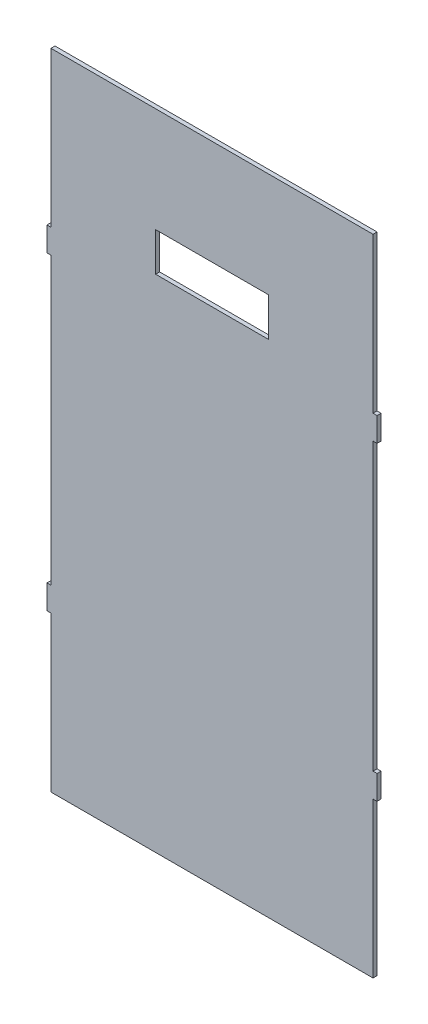
ISO-10303-21;
HEADER;
FILE_DESCRIPTION(('STEP AP214'),'2;1');
FILE_NAME('part.step','',(''),(''),'','','');
FILE_SCHEMA(('AUTOMOTIVE_DESIGN { 1 0 10303 214 1 1 1 1 }'));
ENDSEC;
DATA;
#1=APPLICATION_CONTEXT('core data for automotive mechanical design processes');
#2=APPLICATION_PROTOCOL_DEFINITION('international standard','automotive_design',2000,#1);
#3=PRODUCT_CONTEXT('',#1,'mechanical');
#4=PRODUCT('Part','Part','',(#3));
#5=PRODUCT_RELATED_PRODUCT_CATEGORY('part','',(#4));
#6=PRODUCT_DEFINITION_FORMATION('','',#4);
#7=PRODUCT_DEFINITION_CONTEXT('part definition',#1,'design');
#8=PRODUCT_DEFINITION('design','',#6,#7);
#9=PRODUCT_DEFINITION_SHAPE('','',#8);
#10=(LENGTH_UNIT() NAMED_UNIT(*) SI_UNIT(.MILLI.,.METRE.));
#11=(NAMED_UNIT(*) PLANE_ANGLE_UNIT() SI_UNIT($,.RADIAN.));
#12=(NAMED_UNIT(*) SI_UNIT($,.STERADIAN.) SOLID_ANGLE_UNIT());
#13=UNCERTAINTY_MEASURE_WITH_UNIT(LENGTH_MEASURE(1.E-05),#10,'distance_accuracy_value','');
#14=(GEOMETRIC_REPRESENTATION_CONTEXT(3) GLOBAL_UNCERTAINTY_ASSIGNED_CONTEXT((#13)) GLOBAL_UNIT_ASSIGNED_CONTEXT((#10,
#11,#12)) REPRESENTATION_CONTEXT('',''));
#15=CARTESIAN_POINT('',(0.,0.,0.));
#16=DIRECTION('',(0.,0.,1.));
#17=DIRECTION('',(1.,0.,0.));
#18=AXIS2_PLACEMENT_3D('',#15,#16,#17);
#19=CARTESIAN_POINT('',(200.,-207.5,5.));
#20=DIRECTION('',(-1.,0.,0.));
#21=DIRECTION('',(0.,-1.,0.));
#22=AXIS2_PLACEMENT_3D('',#19,#20,#21);
#23=PLANE('',#22);
#24=DIRECTION('',(0.,1.,0.));
#25=VECTOR('',#24,1.);
#26=CARTESIAN_POINT('',(200.,-207.5,0.));
#27=LINE('',#26,#25);
#28=CARTESIAN_POINT('',(200.,-400.,0.));
#29=VERTEX_POINT('',#28);
#30=CARTESIAN_POINT('',(200.,-207.5,0.));
#31=VERTEX_POINT('',#30);
#32=EDGE_CURVE('E226',#29,#31,#27,.T.);
#33=ORIENTED_EDGE('',*,*,#32,.T.);
#34=DIRECTION('',(0.,0.,-1.));
#35=VECTOR('',#34,1.);
#36=CARTESIAN_POINT('',(200.,-207.5,5.));
#37=LINE('',#36,#35);
#38=CARTESIAN_POINT('',(200.,-207.5,5.));
#39=VERTEX_POINT('',#38);
#40=EDGE_CURVE('E11',#39,#31,#37,.T.);
#41=ORIENTED_EDGE('',*,*,#40,.F.);
#42=DIRECTION('',(0.,1.,0.));
#43=VECTOR('',#42,1.);
#44=CARTESIAN_POINT('',(200.,-207.5,5.));
#45=LINE('',#44,#43);
#46=CARTESIAN_POINT('',(200.,-400.,5.));
#47=VERTEX_POINT('',#46);
#48=EDGE_CURVE('E230',#47,#39,#45,.T.);
#49=ORIENTED_EDGE('',*,*,#48,.F.);
#50=DIRECTION('',(0.,0.,-1.));
#51=VECTOR('',#50,1.);
#52=CARTESIAN_POINT('',(200.,-400.,5.));
#53=LINE('',#52,#51);
#54=EDGE_CURVE('E272',#47,#29,#53,.T.);
#55=ORIENTED_EDGE('',*,*,#54,.T.);
#56=EDGE_LOOP('',(#33,#41,#49,#55));
#57=FACE_BOUND('',#56,.T.);
#58=ADVANCED_FACE('F33',(#57),#23,.F.);
#59=CARTESIAN_POINT('',(205.,-207.5,5.));
#60=DIRECTION('',(0.,1.,0.));
#61=DIRECTION('',(0.,0.,1.));
#62=AXIS2_PLACEMENT_3D('',#59,#60,#61);
#63=PLANE('',#62);
#64=DIRECTION('',(1.,0.,0.));
#65=VECTOR('',#64,1.);
#66=CARTESIAN_POINT('',(205.,-207.5,0.));
#67=LINE('',#66,#65);
#68=CARTESIAN_POINT('',(205.,-207.5,0.));
#69=VERTEX_POINT('',#68);
#70=EDGE_CURVE('E275',#31,#69,#67,.T.);
#71=ORIENTED_EDGE('',*,*,#70,.T.);
#72=DIRECTION('',(0.,0.,-1.));
#73=VECTOR('',#72,1.);
#74=CARTESIAN_POINT('',(205.,-207.5,5.));
#75=LINE('',#74,#73);
#76=CARTESIAN_POINT('',(205.,-207.5,5.));
#77=VERTEX_POINT('',#76);
#78=EDGE_CURVE('E40',#77,#69,#75,.T.);
#79=ORIENTED_EDGE('',*,*,#78,.F.);
#80=DIRECTION('',(1.,0.,0.));
#81=VECTOR('',#80,1.);
#82=CARTESIAN_POINT('',(205.,-207.5,5.));
#83=LINE('',#82,#81);
#84=EDGE_CURVE('E233',#39,#77,#83,.T.);
#85=ORIENTED_EDGE('',*,*,#84,.F.);
#86=ORIENTED_EDGE('',*,*,#40,.T.);
#87=EDGE_LOOP('',(#71,#79,#85,#86));
#88=FACE_BOUND('',#87,.T.);
#89=ADVANCED_FACE('F390',(#88),#63,.F.);
#90=CARTESIAN_POINT('',(205.,-207.5,5.));
#91=DIRECTION('',(-1.,0.,0.));
#92=DIRECTION('',(0.,-1.,0.));
#93=AXIS2_PLACEMENT_3D('',#90,#91,#92);
#94=PLANE('',#93);
#95=DIRECTION('',(0.,1.,0.));
#96=VECTOR('',#95,1.);
#97=CARTESIAN_POINT('',(205.,-207.5,0.));
#98=LINE('',#97,#96);
#99=CARTESIAN_POINT('',(205.,-177.5,0.));
#100=VERTEX_POINT('',#99);
#101=EDGE_CURVE('E277',#69,#100,#98,.T.);
#102=ORIENTED_EDGE('',*,*,#101,.T.);
#103=DIRECTION('',(0.,0.,-1.));
#104=VECTOR('',#103,1.);
#105=CARTESIAN_POINT('',(205.,-177.5,5.));
#106=LINE('',#105,#104);
#107=CARTESIAN_POINT('',(205.,-177.5,5.));
#108=VERTEX_POINT('',#107);
#109=EDGE_CURVE('E362',#108,#100,#106,.T.);
#110=ORIENTED_EDGE('',*,*,#109,.F.);
#111=DIRECTION('',(0.,1.,0.));
#112=VECTOR('',#111,1.);
#113=CARTESIAN_POINT('',(205.,-207.5,5.));
#114=LINE('',#113,#112);
#115=EDGE_CURVE('E236',#77,#108,#114,.T.);
#116=ORIENTED_EDGE('',*,*,#115,.F.);
#117=ORIENTED_EDGE('',*,*,#78,.T.);
#118=EDGE_LOOP('',(#102,#110,#116,#117));
#119=FACE_BOUND('',#118,.T.);
#120=ADVANCED_FACE('F369',(#119),#94,.F.);
#121=CARTESIAN_POINT('',(205.,-177.5,5.));
#122=DIRECTION('',(0.,-1.,0.));
#123=DIRECTION('',(0.,0.,-1.));
#124=AXIS2_PLACEMENT_3D('',#121,#122,#123);
#125=PLANE('',#124);
#126=DIRECTION('',(-1.,0.,0.));
#127=VECTOR('',#126,1.);
#128=CARTESIAN_POINT('',(205.,-177.5,0.));
#129=LINE('',#128,#127);
#130=CARTESIAN_POINT('',(200.,-177.5,0.));
#131=VERTEX_POINT('',#130);
#132=EDGE_CURVE('E279',#100,#131,#129,.T.);
#133=ORIENTED_EDGE('',*,*,#132,.T.);
#134=DIRECTION('',(0.,0.,-1.));
#135=VECTOR('',#134,1.);
#136=CARTESIAN_POINT('',(200.,-177.5,5.));
#137=LINE('',#136,#135);
#138=CARTESIAN_POINT('',(200.,-177.5,5.));
#139=VERTEX_POINT('',#138);
#140=EDGE_CURVE('E359',#139,#131,#137,.T.);
#141=ORIENTED_EDGE('',*,*,#140,.F.);
#142=DIRECTION('',(-1.,0.,0.));
#143=VECTOR('',#142,1.);
#144=CARTESIAN_POINT('',(205.,-177.5,5.));
#145=LINE('',#144,#143);
#146=EDGE_CURVE('E238',#108,#139,#145,.T.);
#147=ORIENTED_EDGE('',*,*,#146,.F.);
#148=ORIENTED_EDGE('',*,*,#109,.T.);
#149=EDGE_LOOP('',(#133,#141,#147,#148));
#150=FACE_BOUND('',#149,.T.);
#151=ADVANCED_FACE('F378',(#150),#125,.F.);
#152=CARTESIAN_POINT('',(200.,177.5,5.));
#153=DIRECTION('',(-1.,0.,0.));
#154=DIRECTION('',(0.,-1.,0.));
#155=AXIS2_PLACEMENT_3D('',#152,#153,#154);
#156=PLANE('',#155);
#157=DIRECTION('',(0.,1.,0.));
#158=VECTOR('',#157,1.);
#159=CARTESIAN_POINT('',(200.,177.5,0.));
#160=LINE('',#159,#158);
#161=CARTESIAN_POINT('',(200.,177.5,0.));
#162=VERTEX_POINT('',#161);
#163=EDGE_CURVE('E281',#131,#162,#160,.T.);
#164=ORIENTED_EDGE('',*,*,#163,.T.);
#165=DIRECTION('',(0.,0.,-1.));
#166=VECTOR('',#165,1.);
#167=CARTESIAN_POINT('',(200.,177.5,5.));
#168=LINE('',#167,#166);
#169=CARTESIAN_POINT('',(200.,177.5,5.));
#170=VERTEX_POINT('',#169);
#171=EDGE_CURVE('E356',#170,#162,#168,.T.);
#172=ORIENTED_EDGE('',*,*,#171,.F.);
#173=DIRECTION('',(0.,1.,0.));
#174=VECTOR('',#173,1.);
#175=CARTESIAN_POINT('',(200.,177.5,5.));
#176=LINE('',#175,#174);
#177=EDGE_CURVE('E240',#139,#170,#176,.T.);
#178=ORIENTED_EDGE('',*,*,#177,.F.);
#179=ORIENTED_EDGE('',*,*,#140,.T.);
#180=EDGE_LOOP('',(#164,#172,#178,#179));
#181=FACE_BOUND('',#180,.T.);
#182=ADVANCED_FACE('F382',(#181),#156,.F.);
#183=CARTESIAN_POINT('',(205.,177.5,5.));
#184=DIRECTION('',(0.,1.,0.));
#185=DIRECTION('',(0.,0.,1.));
#186=AXIS2_PLACEMENT_3D('',#183,#184,#185);
#187=PLANE('',#186);
#188=DIRECTION('',(1.,0.,0.));
#189=VECTOR('',#188,1.);
#190=CARTESIAN_POINT('',(205.,177.5,0.));
#191=LINE('',#190,#189);
#192=CARTESIAN_POINT('',(205.,177.5,0.));
#193=VERTEX_POINT('',#192);
#194=EDGE_CURVE('E283',#162,#193,#191,.T.);
#195=ORIENTED_EDGE('',*,*,#194,.T.);
#196=DIRECTION('',(0.,0.,-1.));
#197=VECTOR('',#196,1.);
#198=CARTESIAN_POINT('',(205.,177.5,5.));
#199=LINE('',#198,#197);
#200=CARTESIAN_POINT('',(205.,177.5,5.));
#201=VERTEX_POINT('',#200);
#202=EDGE_CURVE('E353',#201,#193,#199,.T.);
#203=ORIENTED_EDGE('',*,*,#202,.F.);
#204=DIRECTION('',(1.,0.,0.));
#205=VECTOR('',#204,1.);
#206=CARTESIAN_POINT('',(205.,177.5,5.));
#207=LINE('',#206,#205);
#208=EDGE_CURVE('E242',#170,#201,#207,.T.);
#209=ORIENTED_EDGE('',*,*,#208,.F.);
#210=ORIENTED_EDGE('',*,*,#171,.T.);
#211=EDGE_LOOP('',(#195,#203,#209,#210));
#212=FACE_BOUND('',#211,.T.);
#213=ADVANCED_FACE('F463',(#212),#187,.F.);
#214=CARTESIAN_POINT('',(205.,207.5,5.));
#215=DIRECTION('',(-1.,0.,0.));
#216=DIRECTION('',(0.,-1.,0.));
#217=AXIS2_PLACEMENT_3D('',#214,#215,#216);
#218=PLANE('',#217);
#219=DIRECTION('',(0.,1.,0.));
#220=VECTOR('',#219,1.);
#221=CARTESIAN_POINT('',(205.,207.5,0.));
#222=LINE('',#221,#220);
#223=CARTESIAN_POINT('',(205.,207.5,0.));
#224=VERTEX_POINT('',#223);
#225=EDGE_CURVE('E285',#193,#224,#222,.T.);
#226=ORIENTED_EDGE('',*,*,#225,.T.);
#227=DIRECTION('',(0.,0.,-1.));
#228=VECTOR('',#227,1.);
#229=CARTESIAN_POINT('',(205.,207.5,5.));
#230=LINE('',#229,#228);
#231=CARTESIAN_POINT('',(205.,207.5,5.));
#232=VERTEX_POINT('',#231);
#233=EDGE_CURVE('E350',#232,#224,#230,.T.);
#234=ORIENTED_EDGE('',*,*,#233,.F.);
#235=DIRECTION('',(0.,1.,0.));
#236=VECTOR('',#235,1.);
#237=CARTESIAN_POINT('',(205.,207.5,5.));
#238=LINE('',#237,#236);
#239=EDGE_CURVE('E244',#201,#232,#238,.T.);
#240=ORIENTED_EDGE('',*,*,#239,.F.);
#241=ORIENTED_EDGE('',*,*,#202,.T.);
#242=EDGE_LOOP('',(#226,#234,#240,#241));
#243=FACE_BOUND('',#242,.T.);
#244=ADVANCED_FACE('F461',(#243),#218,.F.);
#245=CARTESIAN_POINT('',(205.,207.5,5.));
#246=DIRECTION('',(0.,-1.,0.));
#247=DIRECTION('',(0.,0.,-1.));
#248=AXIS2_PLACEMENT_3D('',#245,#246,#247);
#249=PLANE('',#248);
#250=DIRECTION('',(-1.,0.,0.));
#251=VECTOR('',#250,1.);
#252=CARTESIAN_POINT('',(205.,207.5,0.));
#253=LINE('',#252,#251);
#254=CARTESIAN_POINT('',(200.,207.5,0.));
#255=VERTEX_POINT('',#254);
#256=EDGE_CURVE('E287',#224,#255,#253,.T.);
#257=ORIENTED_EDGE('',*,*,#256,.T.);
#258=DIRECTION('',(0.,0.,-1.));
#259=VECTOR('',#258,1.);
#260=CARTESIAN_POINT('',(200.,207.5,5.));
#261=LINE('',#260,#259);
#262=CARTESIAN_POINT('',(200.,207.5,5.));
#263=VERTEX_POINT('',#262);
#264=EDGE_CURVE('E347',#263,#255,#261,.T.);
#265=ORIENTED_EDGE('',*,*,#264,.F.);
#266=DIRECTION('',(-1.,0.,0.));
#267=VECTOR('',#266,1.);
#268=CARTESIAN_POINT('',(205.,207.5,5.));
#269=LINE('',#268,#267);
#270=EDGE_CURVE('E246',#232,#263,#269,.T.);
#271=ORIENTED_EDGE('',*,*,#270,.F.);
#272=ORIENTED_EDGE('',*,*,#233,.T.);
#273=EDGE_LOOP('',(#257,#265,#271,#272));
#274=FACE_BOUND('',#273,.T.);
#275=ADVANCED_FACE('F456',(#274),#249,.F.);
#276=CARTESIAN_POINT('',(200.,400.,5.));
#277=DIRECTION('',(-1.,0.,0.));
#278=DIRECTION('',(0.,-1.,0.));
#279=AXIS2_PLACEMENT_3D('',#276,#277,#278);
#280=PLANE('',#279);
#281=DIRECTION('',(0.,1.,0.));
#282=VECTOR('',#281,1.);
#283=CARTESIAN_POINT('',(200.,400.,0.));
#284=LINE('',#283,#282);
#285=CARTESIAN_POINT('',(200.,400.,0.));
#286=VERTEX_POINT('',#285);
#287=EDGE_CURVE('E289',#255,#286,#284,.T.);
#288=ORIENTED_EDGE('',*,*,#287,.T.);
#289=DIRECTION('',(0.,0.,-1.));
#290=VECTOR('',#289,1.);
#291=CARTESIAN_POINT('',(200.,400.,5.));
#292=LINE('',#291,#290);
#293=CARTESIAN_POINT('',(200.,400.,5.));
#294=VERTEX_POINT('',#293);
#295=EDGE_CURVE('E344',#294,#286,#292,.T.);
#296=ORIENTED_EDGE('',*,*,#295,.F.);
#297=DIRECTION('',(0.,1.,0.));
#298=VECTOR('',#297,1.);
#299=CARTESIAN_POINT('',(200.,400.,5.));
#300=LINE('',#299,#298);
#301=EDGE_CURVE('E248',#263,#294,#300,.T.);
#302=ORIENTED_EDGE('',*,*,#301,.F.);
#303=ORIENTED_EDGE('',*,*,#264,.T.);
#304=EDGE_LOOP('',(#288,#296,#302,#303));
#305=FACE_BOUND('',#304,.T.);
#306=ADVANCED_FACE('F451',(#305),#280,.F.);
#307=CARTESIAN_POINT('',(-200.,400.,5.));
#308=DIRECTION('',(0.,-1.,0.));
#309=DIRECTION('',(0.,0.,-1.));
#310=AXIS2_PLACEMENT_3D('',#307,#308,#309);
#311=PLANE('',#310);
#312=DIRECTION('',(-1.,0.,0.));
#313=VECTOR('',#312,1.);
#314=CARTESIAN_POINT('',(-200.,400.,0.));
#315=LINE('',#314,#313);
#316=CARTESIAN_POINT('',(-200.,400.,0.));
#317=VERTEX_POINT('',#316);
#318=EDGE_CURVE('E291',#286,#317,#315,.T.);
#319=ORIENTED_EDGE('',*,*,#318,.T.);
#320=DIRECTION('',(0.,0.,-1.));
#321=VECTOR('',#320,1.);
#322=CARTESIAN_POINT('',(-200.,400.,5.));
#323=LINE('',#322,#321);
#324=CARTESIAN_POINT('',(-200.,400.,5.));
#325=VERTEX_POINT('',#324);
#326=EDGE_CURVE('E341',#325,#317,#323,.T.);
#327=ORIENTED_EDGE('',*,*,#326,.F.);
#328=DIRECTION('',(-1.,0.,0.));
#329=VECTOR('',#328,1.);
#330=CARTESIAN_POINT('',(-200.,400.,5.));
#331=LINE('',#330,#329);
#332=EDGE_CURVE('E250',#294,#325,#331,.T.);
#333=ORIENTED_EDGE('',*,*,#332,.F.);
#334=ORIENTED_EDGE('',*,*,#295,.T.);
#335=EDGE_LOOP('',(#319,#327,#333,#334));
#336=FACE_BOUND('',#335,.T.);
#337=ADVANCED_FACE('F447',(#336),#311,.F.);
#338=CARTESIAN_POINT('',(-200.,400.,5.));
#339=DIRECTION('',(1.,0.,0.));
#340=DIRECTION('',(0.,1.,0.));
#341=AXIS2_PLACEMENT_3D('',#338,#339,#340);
#342=PLANE('',#341);
#343=DIRECTION('',(0.,-1.,0.));
#344=VECTOR('',#343,1.);
#345=CARTESIAN_POINT('',(-200.,400.,0.));
#346=LINE('',#345,#344);
#347=CARTESIAN_POINT('',(-200.,207.5,0.));
#348=VERTEX_POINT('',#347);
#349=EDGE_CURVE('E293',#317,#348,#346,.T.);
#350=ORIENTED_EDGE('',*,*,#349,.T.);
#351=DIRECTION('',(0.,0.,-1.));
#352=VECTOR('',#351,1.);
#353=CARTESIAN_POINT('',(-200.,207.5,5.));
#354=LINE('',#353,#352);
#355=CARTESIAN_POINT('',(-200.,207.5,5.));
#356=VERTEX_POINT('',#355);
#357=EDGE_CURVE('E338',#356,#348,#354,.T.);
#358=ORIENTED_EDGE('',*,*,#357,.F.);
#359=DIRECTION('',(0.,-1.,0.));
#360=VECTOR('',#359,1.);
#361=CARTESIAN_POINT('',(-200.,400.,5.));
#362=LINE('',#361,#360);
#363=EDGE_CURVE('E252',#325,#356,#362,.T.);
#364=ORIENTED_EDGE('',*,*,#363,.F.);
#365=ORIENTED_EDGE('',*,*,#326,.T.);
#366=EDGE_LOOP('',(#350,#358,#364,#365));
#367=FACE_BOUND('',#366,.T.);
#368=ADVANCED_FACE('F442',(#367),#342,.F.);
#369=CARTESIAN_POINT('',(-205.,207.5,5.));
#370=DIRECTION('',(0.,-1.,0.));
#371=DIRECTION('',(0.,0.,-1.));
#372=AXIS2_PLACEMENT_3D('',#369,#370,#371);
#373=PLANE('',#372);
#374=DIRECTION('',(-1.,0.,0.));
#375=VECTOR('',#374,1.);
#376=CARTESIAN_POINT('',(-205.,207.5,0.));
#377=LINE('',#376,#375);
#378=CARTESIAN_POINT('',(-205.,207.5,0.));
#379=VERTEX_POINT('',#378);
#380=EDGE_CURVE('E295',#348,#379,#377,.T.);
#381=ORIENTED_EDGE('',*,*,#380,.T.);
#382=DIRECTION('',(0.,0.,-1.));
#383=VECTOR('',#382,1.);
#384=CARTESIAN_POINT('',(-205.,207.5,5.));
#385=LINE('',#384,#383);
#386=CARTESIAN_POINT('',(-205.,207.5,5.));
#387=VERTEX_POINT('',#386);
#388=EDGE_CURVE('E335',#387,#379,#385,.T.);
#389=ORIENTED_EDGE('',*,*,#388,.F.);
#390=DIRECTION('',(-1.,0.,0.));
#391=VECTOR('',#390,1.);
#392=CARTESIAN_POINT('',(-205.,207.5,5.));
#393=LINE('',#392,#391);
#394=EDGE_CURVE('E254',#356,#387,#393,.T.);
#395=ORIENTED_EDGE('',*,*,#394,.F.);
#396=ORIENTED_EDGE('',*,*,#357,.T.);
#397=EDGE_LOOP('',(#381,#389,#395,#396));
#398=FACE_BOUND('',#397,.T.);
#399=ADVANCED_FACE('F436',(#398),#373,.F.);
#400=CARTESIAN_POINT('',(-205.,207.5,5.));
#401=DIRECTION('',(1.,0.,0.));
#402=DIRECTION('',(0.,1.,0.));
#403=AXIS2_PLACEMENT_3D('',#400,#401,#402);
#404=PLANE('',#403);
#405=DIRECTION('',(0.,-1.,0.));
#406=VECTOR('',#405,1.);
#407=CARTESIAN_POINT('',(-205.,207.5,0.));
#408=LINE('',#407,#406);
#409=CARTESIAN_POINT('',(-205.,177.5,0.));
#410=VERTEX_POINT('',#409);
#411=EDGE_CURVE('E297',#379,#410,#408,.T.);
#412=ORIENTED_EDGE('',*,*,#411,.T.);
#413=DIRECTION('',(0.,0.,-1.));
#414=VECTOR('',#413,1.);
#415=CARTESIAN_POINT('',(-205.,177.5,5.));
#416=LINE('',#415,#414);
#417=CARTESIAN_POINT('',(-205.,177.5,5.));
#418=VERTEX_POINT('',#417);
#419=EDGE_CURVE('E332',#418,#410,#416,.T.);
#420=ORIENTED_EDGE('',*,*,#419,.F.);
#421=DIRECTION('',(0.,-1.,0.));
#422=VECTOR('',#421,1.);
#423=CARTESIAN_POINT('',(-205.,207.5,5.));
#424=LINE('',#423,#422);
#425=EDGE_CURVE('E256',#387,#418,#424,.T.);
#426=ORIENTED_EDGE('',*,*,#425,.F.);
#427=ORIENTED_EDGE('',*,*,#388,.T.);
#428=EDGE_LOOP('',(#412,#420,#426,#427));
#429=FACE_BOUND('',#428,.T.);
#430=ADVANCED_FACE('F432',(#429),#404,.F.);
#431=CARTESIAN_POINT('',(-205.,177.5,5.));
#432=DIRECTION('',(0.,1.,0.));
#433=DIRECTION('',(-1.,0.,0.));
#434=AXIS2_PLACEMENT_3D('',#431,#432,#433);
#435=PLANE('',#434);
#436=DIRECTION('',(1.,0.,0.));
#437=VECTOR('',#436,1.);
#438=CARTESIAN_POINT('',(-205.,177.5,0.));
#439=LINE('',#438,#437);
#440=CARTESIAN_POINT('',(-200.,177.5,0.));
#441=VERTEX_POINT('',#440);
#442=EDGE_CURVE('E299',#410,#441,#439,.T.);
#443=ORIENTED_EDGE('',*,*,#442,.T.);
#444=DIRECTION('',(0.,0.,-1.));
#445=VECTOR('',#444,1.);
#446=CARTESIAN_POINT('',(-200.,177.5,5.));
#447=LINE('',#446,#445);
#448=CARTESIAN_POINT('',(-200.,177.5,5.));
#449=VERTEX_POINT('',#448);
#450=EDGE_CURVE('E329',#449,#441,#447,.T.);
#451=ORIENTED_EDGE('',*,*,#450,.F.);
#452=DIRECTION('',(1.,0.,0.));
#453=VECTOR('',#452,1.);
#454=CARTESIAN_POINT('',(-205.,177.5,5.));
#455=LINE('',#454,#453);
#456=EDGE_CURVE('E258',#418,#449,#455,.T.);
#457=ORIENTED_EDGE('',*,*,#456,.F.);
#458=ORIENTED_EDGE('',*,*,#419,.T.);
#459=EDGE_LOOP('',(#443,#451,#457,#458));
#460=FACE_BOUND('',#459,.T.);
#461=ADVANCED_FACE('F427',(#460),#435,.F.);
#462=CARTESIAN_POINT('',(-200.,177.5,5.));
#463=DIRECTION('',(1.,0.,0.));
#464=DIRECTION('',(0.,0.,-1.));
#465=AXIS2_PLACEMENT_3D('',#462,#463,#464);
#466=PLANE('',#465);
#467=DIRECTION('',(0.,-1.,0.));
#468=VECTOR('',#467,1.);
#469=CARTESIAN_POINT('',(-200.,177.5,0.));
#470=LINE('',#469,#468);
#471=CARTESIAN_POINT('',(-200.,-177.5,0.));
#472=VERTEX_POINT('',#471);
#473=EDGE_CURVE('E301',#441,#472,#470,.T.);
#474=ORIENTED_EDGE('',*,*,#473,.T.);
#475=DIRECTION('',(0.,0.,-1.));
#476=VECTOR('',#475,1.);
#477=CARTESIAN_POINT('',(-200.,-177.5,5.));
#478=LINE('',#477,#476);
#479=CARTESIAN_POINT('',(-200.,-177.5,5.));
#480=VERTEX_POINT('',#479);
#481=EDGE_CURVE('E326',#480,#472,#478,.T.);
#482=ORIENTED_EDGE('',*,*,#481,.F.);
#483=DIRECTION('',(0.,-1.,0.));
#484=VECTOR('',#483,1.);
#485=CARTESIAN_POINT('',(-200.,177.5,5.));
#486=LINE('',#485,#484);
#487=EDGE_CURVE('E260',#449,#480,#486,.T.);
#488=ORIENTED_EDGE('',*,*,#487,.F.);
#489=ORIENTED_EDGE('',*,*,#450,.T.);
#490=EDGE_LOOP('',(#474,#482,#488,#489));
#491=FACE_BOUND('',#490,.T.);
#492=ADVANCED_FACE('F421',(#491),#466,.F.);
#493=CARTESIAN_POINT('',(-205.,-177.5,5.));
#494=DIRECTION('',(0.,-1.,0.));
#495=DIRECTION('',(1.,0.,0.));
#496=AXIS2_PLACEMENT_3D('',#493,#494,#495);
#497=PLANE('',#496);
#498=DIRECTION('',(-1.,0.,0.));
#499=VECTOR('',#498,1.);
#500=CARTESIAN_POINT('',(-205.,-177.5,0.));
#501=LINE('',#500,#499);
#502=CARTESIAN_POINT('',(-205.,-177.5,0.));
#503=VERTEX_POINT('',#502);
#504=EDGE_CURVE('E303',#472,#503,#501,.T.);
#505=ORIENTED_EDGE('',*,*,#504,.T.);
#506=DIRECTION('',(0.,0.,-1.));
#507=VECTOR('',#506,1.);
#508=CARTESIAN_POINT('',(-205.,-177.5,5.));
#509=LINE('',#508,#507);
#510=CARTESIAN_POINT('',(-205.,-177.5,5.));
#511=VERTEX_POINT('',#510);
#512=EDGE_CURVE('E323',#511,#503,#509,.T.);
#513=ORIENTED_EDGE('',*,*,#512,.F.);
#514=DIRECTION('',(-1.,0.,0.));
#515=VECTOR('',#514,1.);
#516=CARTESIAN_POINT('',(-205.,-177.5,5.));
#517=LINE('',#516,#515);
#518=EDGE_CURVE('E262',#480,#511,#517,.T.);
#519=ORIENTED_EDGE('',*,*,#518,.F.);
#520=ORIENTED_EDGE('',*,*,#481,.T.);
#521=EDGE_LOOP('',(#505,#513,#519,#520));
#522=FACE_BOUND('',#521,.T.);
#523=ADVANCED_FACE('F417',(#522),#497,.F.);
#524=CARTESIAN_POINT('',(-205.,-207.5,5.));
#525=DIRECTION('',(1.,0.,0.));
#526=DIRECTION('',(0.,1.,0.));
#527=AXIS2_PLACEMENT_3D('',#524,#525,#526);
#528=PLANE('',#527);
#529=DIRECTION('',(0.,-1.,0.));
#530=VECTOR('',#529,1.);
#531=CARTESIAN_POINT('',(-205.,-207.5,0.));
#532=LINE('',#531,#530);
#533=CARTESIAN_POINT('',(-205.,-207.5,0.));
#534=VERTEX_POINT('',#533);
#535=EDGE_CURVE('E305',#503,#534,#532,.T.);
#536=ORIENTED_EDGE('',*,*,#535,.T.);
#537=DIRECTION('',(0.,0.,-1.));
#538=VECTOR('',#537,1.);
#539=CARTESIAN_POINT('',(-205.,-207.5,5.));
#540=LINE('',#539,#538);
#541=CARTESIAN_POINT('',(-205.,-207.5,5.));
#542=VERTEX_POINT('',#541);
#543=EDGE_CURVE('E320',#542,#534,#540,.T.);
#544=ORIENTED_EDGE('',*,*,#543,.F.);
#545=DIRECTION('',(0.,-1.,0.));
#546=VECTOR('',#545,1.);
#547=CARTESIAN_POINT('',(-205.,-207.5,5.));
#548=LINE('',#547,#546);
#549=EDGE_CURVE('E264',#511,#542,#548,.T.);
#550=ORIENTED_EDGE('',*,*,#549,.F.);
#551=ORIENTED_EDGE('',*,*,#512,.T.);
#552=EDGE_LOOP('',(#536,#544,#550,#551));
#553=FACE_BOUND('',#552,.T.);
#554=ADVANCED_FACE('F412',(#553),#528,.F.);
#555=CARTESIAN_POINT('',(-205.,-207.5,5.));
#556=DIRECTION('',(0.,1.,0.));
#557=DIRECTION('',(0.,0.,1.));
#558=AXIS2_PLACEMENT_3D('',#555,#556,#557);
#559=PLANE('',#558);
#560=DIRECTION('',(1.,0.,0.));
#561=VECTOR('',#560,1.);
#562=CARTESIAN_POINT('',(-205.,-207.5,0.));
#563=LINE('',#562,#561);
#564=CARTESIAN_POINT('',(-200.,-207.5,0.));
#565=VERTEX_POINT('',#564);
#566=EDGE_CURVE('E307',#534,#565,#563,.T.);
#567=ORIENTED_EDGE('',*,*,#566,.T.);
#568=DIRECTION('',(0.,0.,-1.));
#569=VECTOR('',#568,1.);
#570=CARTESIAN_POINT('',(-200.,-207.5,5.));
#571=LINE('',#570,#569);
#572=CARTESIAN_POINT('',(-200.,-207.5,5.));
#573=VERTEX_POINT('',#572);
#574=EDGE_CURVE('E317',#573,#565,#571,.T.);
#575=ORIENTED_EDGE('',*,*,#574,.F.);
#576=DIRECTION('',(1.,0.,0.));
#577=VECTOR('',#576,1.);
#578=CARTESIAN_POINT('',(-205.,-207.5,5.));
#579=LINE('',#578,#577);
#580=EDGE_CURVE('E266',#542,#573,#579,.T.);
#581=ORIENTED_EDGE('',*,*,#580,.F.);
#582=ORIENTED_EDGE('',*,*,#543,.T.);
#583=EDGE_LOOP('',(#567,#575,#581,#582));
#584=FACE_BOUND('',#583,.T.);
#585=ADVANCED_FACE('F406',(#584),#559,.F.);
#586=CARTESIAN_POINT('',(-200.,-207.5,5.));
#587=DIRECTION('',(1.,0.,0.));
#588=DIRECTION('',(0.,1.,0.));
#589=AXIS2_PLACEMENT_3D('',#586,#587,#588);
#590=PLANE('',#589);
#591=DIRECTION('',(0.,-1.,0.));
#592=VECTOR('',#591,1.);
#593=CARTESIAN_POINT('',(-200.,-207.5,0.));
#594=LINE('',#593,#592);
#595=CARTESIAN_POINT('',(-200.,-400.,0.));
#596=VERTEX_POINT('',#595);
#597=EDGE_CURVE('E309',#565,#596,#594,.T.);
#598=ORIENTED_EDGE('',*,*,#597,.T.);
#599=DIRECTION('',(0.,0.,-1.));
#600=VECTOR('',#599,1.);
#601=CARTESIAN_POINT('',(-200.,-400.,5.));
#602=LINE('',#601,#600);
#603=CARTESIAN_POINT('',(-200.,-400.,5.));
#604=VERTEX_POINT('',#603);
#605=EDGE_CURVE('E314',#604,#596,#602,.T.);
#606=ORIENTED_EDGE('',*,*,#605,.F.);
#607=DIRECTION('',(0.,-1.,0.));
#608=VECTOR('',#607,1.);
#609=CARTESIAN_POINT('',(-200.,-207.5,5.));
#610=LINE('',#609,#608);
#611=EDGE_CURVE('E268',#573,#604,#610,.T.);
#612=ORIENTED_EDGE('',*,*,#611,.F.);
#613=ORIENTED_EDGE('',*,*,#574,.T.);
#614=EDGE_LOOP('',(#598,#606,#612,#613));
#615=FACE_BOUND('',#614,.T.);
#616=ADVANCED_FACE('F402',(#615),#590,.F.);
#617=CARTESIAN_POINT('',(-200.,-400.,5.));
#618=DIRECTION('',(0.,1.,0.));
#619=DIRECTION('',(-1.,0.,0.));
#620=AXIS2_PLACEMENT_3D('',#617,#618,#619);
#621=PLANE('',#620);
#622=DIRECTION('',(1.,0.,0.));
#623=VECTOR('',#622,1.);
#624=CARTESIAN_POINT('',(-200.,-400.,0.));
#625=LINE('',#624,#623);
#626=EDGE_CURVE('E234',#596,#29,#625,.T.);
#627=ORIENTED_EDGE('',*,*,#626,.T.);
#628=ORIENTED_EDGE('',*,*,#54,.F.);
#629=DIRECTION('',(1.,0.,0.));
#630=VECTOR('',#629,1.);
#631=CARTESIAN_POINT('',(-200.,-400.,5.));
#632=LINE('',#631,#630);
#633=EDGE_CURVE('E270',#604,#47,#632,.T.);
#634=ORIENTED_EDGE('',*,*,#633,.F.);
#635=ORIENTED_EDGE('',*,*,#605,.T.);
#636=EDGE_LOOP('',(#627,#628,#634,#635));
#637=FACE_BOUND('',#636,.T.);
#638=ADVANCED_FACE('F397',(#637),#621,.F.);
#639=CARTESIAN_POINT('',(0.,0.,5.));
#640=DIRECTION('',(0.,0.,1.));
#641=DIRECTION('',(1.,0.,0.));
#642=AXIS2_PLACEMENT_3D('',#639,#640,#641);
#643=PLANE('',#642);
#644=DIRECTION('',(0.,-1.,0.));
#645=VECTOR('',#644,1.);
#646=CARTESIAN_POINT('',(-69.9999999999999,222.,5.));
#647=LINE('',#646,#645);
#648=CARTESIAN_POINT('',(-69.9999999999999,270.,5.));
#649=VERTEX_POINT('',#648);
#650=CARTESIAN_POINT('',(-69.9999999999999,222.,5.));
#651=VERTEX_POINT('',#650);
#652=EDGE_CURVE('E47',#649,#651,#647,.T.);
#653=ORIENTED_EDGE('',*,*,#652,.F.);
#654=DIRECTION('',(-1.,0.,0.));
#655=VECTOR('',#654,1.);
#656=CARTESIAN_POINT('',(-69.9999999999999,270.,5.));
#657=LINE('',#656,#655);
#658=CARTESIAN_POINT('',(70.0000000000003,270.,5.));
#659=VERTEX_POINT('',#658);
#660=EDGE_CURVE('E211',#659,#649,#657,.T.);
#661=ORIENTED_EDGE('',*,*,#660,.F.);
#662=DIRECTION('',(0.,1.,0.));
#663=VECTOR('',#662,1.);
#664=CARTESIAN_POINT('',(70.0000000000003,222.,5.));
#665=LINE('',#664,#663);
#666=CARTESIAN_POINT('',(70.0000000000003,222.,5.));
#667=VERTEX_POINT('',#666);
#668=EDGE_CURVE('E214',#667,#659,#665,.T.);
#669=ORIENTED_EDGE('',*,*,#668,.F.);
#670=DIRECTION('',(1.,0.,0.));
#671=VECTOR('',#670,1.);
#672=CARTESIAN_POINT('',(-69.9999999999999,222.,5.));
#673=LINE('',#672,#671);
#674=EDGE_CURVE('E220',#651,#667,#673,.T.);
#675=ORIENTED_EDGE('',*,*,#674,.F.);
#676=EDGE_LOOP('',(#653,#661,#669,#675));
#677=FACE_BOUND('',#676,.T.);
#678=ORIENTED_EDGE('',*,*,#48,.T.);
#679=ORIENTED_EDGE('',*,*,#84,.T.);
#680=ORIENTED_EDGE('',*,*,#115,.T.);
#681=ORIENTED_EDGE('',*,*,#146,.T.);
#682=ORIENTED_EDGE('',*,*,#177,.T.);
#683=ORIENTED_EDGE('',*,*,#208,.T.);
#684=ORIENTED_EDGE('',*,*,#239,.T.);
#685=ORIENTED_EDGE('',*,*,#270,.T.);
#686=ORIENTED_EDGE('',*,*,#301,.T.);
#687=ORIENTED_EDGE('',*,*,#332,.T.);
#688=ORIENTED_EDGE('',*,*,#363,.T.);
#689=ORIENTED_EDGE('',*,*,#394,.T.);
#690=ORIENTED_EDGE('',*,*,#425,.T.);
#691=ORIENTED_EDGE('',*,*,#456,.T.);
#692=ORIENTED_EDGE('',*,*,#487,.T.);
#693=ORIENTED_EDGE('',*,*,#518,.T.);
#694=ORIENTED_EDGE('',*,*,#549,.T.);
#695=ORIENTED_EDGE('',*,*,#580,.T.);
#696=ORIENTED_EDGE('',*,*,#611,.T.);
#697=ORIENTED_EDGE('',*,*,#633,.T.);
#698=EDGE_LOOP('',(#678,#679,#680,#681,#682,#683,#684,#685,#686,#687,#688,#689,#690,#691,#692,
#693,#694,#695,#696,#697));
#699=FACE_BOUND('',#698,.T.);
#700=ADVANCED_FACE('F386',(#677,#699),#643,.T.);
#701=CARTESIAN_POINT('',(0.,0.,0.));
#702=DIRECTION('',(0.,0.,1.));
#703=DIRECTION('',(1.,0.,0.));
#704=AXIS2_PLACEMENT_3D('',#701,#702,#703);
#705=PLANE('',#704);
#706=DIRECTION('',(-1.,0.,0.));
#707=VECTOR('',#706,1.);
#708=CARTESIAN_POINT('',(-69.9999999999999,270.,0.));
#709=LINE('',#708,#707);
#710=CARTESIAN_POINT('',(70.0000000000003,270.,0.));
#711=VERTEX_POINT('',#710);
#712=CARTESIAN_POINT('',(-69.9999999999999,270.,0.));
#713=VERTEX_POINT('',#712);
#714=EDGE_CURVE('E201',#711,#713,#709,.T.);
#715=ORIENTED_EDGE('',*,*,#714,.T.);
#716=DIRECTION('',(0.,-1.,0.));
#717=VECTOR('',#716,1.);
#718=CARTESIAN_POINT('',(-69.9999999999999,222.,0.));
#719=LINE('',#718,#717);
#720=CARTESIAN_POINT('',(-69.9999999999999,222.,0.));
#721=VERTEX_POINT('',#720);
#722=EDGE_CURVE('E195',#713,#721,#719,.T.);
#723=ORIENTED_EDGE('',*,*,#722,.T.);
#724=DIRECTION('',(1.,0.,0.));
#725=VECTOR('',#724,1.);
#726=CARTESIAN_POINT('',(-69.9999999999999,222.,0.));
#727=LINE('',#726,#725);
#728=CARTESIAN_POINT('',(70.0000000000003,222.,0.));
#729=VERTEX_POINT('',#728);
#730=EDGE_CURVE('E204',#721,#729,#727,.T.);
#731=ORIENTED_EDGE('',*,*,#730,.T.);
#732=DIRECTION('',(0.,1.,0.));
#733=VECTOR('',#732,1.);
#734=CARTESIAN_POINT('',(70.0000000000003,222.,0.));
#735=LINE('',#734,#733);
#736=EDGE_CURVE('E55',#729,#711,#735,.T.);
#737=ORIENTED_EDGE('',*,*,#736,.T.);
#738=EDGE_LOOP('',(#715,#723,#731,#737));
#739=FACE_BOUND('',#738,.T.);
#740=ORIENTED_EDGE('',*,*,#32,.F.);
#741=ORIENTED_EDGE('',*,*,#626,.F.);
#742=ORIENTED_EDGE('',*,*,#597,.F.);
#743=ORIENTED_EDGE('',*,*,#566,.F.);
#744=ORIENTED_EDGE('',*,*,#535,.F.);
#745=ORIENTED_EDGE('',*,*,#504,.F.);
#746=ORIENTED_EDGE('',*,*,#473,.F.);
#747=ORIENTED_EDGE('',*,*,#442,.F.);
#748=ORIENTED_EDGE('',*,*,#411,.F.);
#749=ORIENTED_EDGE('',*,*,#380,.F.);
#750=ORIENTED_EDGE('',*,*,#349,.F.);
#751=ORIENTED_EDGE('',*,*,#318,.F.);
#752=ORIENTED_EDGE('',*,*,#287,.F.);
#753=ORIENTED_EDGE('',*,*,#256,.F.);
#754=ORIENTED_EDGE('',*,*,#225,.F.);
#755=ORIENTED_EDGE('',*,*,#194,.F.);
#756=ORIENTED_EDGE('',*,*,#163,.F.);
#757=ORIENTED_EDGE('',*,*,#132,.F.);
#758=ORIENTED_EDGE('',*,*,#101,.F.);
#759=ORIENTED_EDGE('',*,*,#70,.F.);
#760=EDGE_LOOP('',(#740,#741,#742,#743,#744,#745,#746,#747,#748,#749,#750,#751,#752,#753,#754,
#755,#756,#757,#758,#759));
#761=FACE_BOUND('',#760,.T.);
#762=ADVANCED_FACE('F208',(#739,#761),#705,.F.);
#763=CARTESIAN_POINT('',(-69.9999999999999,222.,0.));
#764=DIRECTION('',(-1.,0.,0.));
#765=DIRECTION('',(0.,0.,1.));
#766=AXIS2_PLACEMENT_3D('',#763,#764,#765);
#767=PLANE('',#766);
#768=ORIENTED_EDGE('',*,*,#652,.T.);
#769=DIRECTION('',(0.,0.,1.));
#770=VECTOR('',#769,1.);
#771=CARTESIAN_POINT('',(-69.9999999999999,222.,0.));
#772=LINE('',#771,#770);
#773=EDGE_CURVE('E191',#721,#651,#772,.T.);
#774=ORIENTED_EDGE('',*,*,#773,.F.);
#775=ORIENTED_EDGE('',*,*,#722,.F.);
#776=DIRECTION('',(0.,0.,1.));
#777=VECTOR('',#776,1.);
#778=CARTESIAN_POINT('',(-69.9999999999999,270.,0.));
#779=LINE('',#778,#777);
#780=EDGE_CURVE('E224',#713,#649,#779,.T.);
#781=ORIENTED_EDGE('',*,*,#780,.T.);
#782=EDGE_LOOP('',(#768,#774,#775,#781));
#783=FACE_BOUND('',#782,.T.);
#784=ADVANCED_FACE('F193',(#783),#767,.F.);
#785=CARTESIAN_POINT('',(-69.9999999999999,270.,0.));
#786=DIRECTION('',(0.,1.,0.));
#787=DIRECTION('',(0.,0.,1.));
#788=AXIS2_PLACEMENT_3D('',#785,#786,#787);
#789=PLANE('',#788);
#790=ORIENTED_EDGE('',*,*,#660,.T.);
#791=ORIENTED_EDGE('',*,*,#780,.F.);
#792=ORIENTED_EDGE('',*,*,#714,.F.);
#793=DIRECTION('',(0.,0.,1.));
#794=VECTOR('',#793,1.);
#795=CARTESIAN_POINT('',(70.0000000000003,270.,0.));
#796=LINE('',#795,#794);
#797=EDGE_CURVE('E227',#711,#659,#796,.T.);
#798=ORIENTED_EDGE('',*,*,#797,.T.);
#799=EDGE_LOOP('',(#790,#791,#792,#798));
#800=FACE_BOUND('',#799,.T.);
#801=ADVANCED_FACE('F626',(#800),#789,.F.);
#802=CARTESIAN_POINT('',(70.0000000000003,222.,0.));
#803=DIRECTION('',(1.,0.,0.));
#804=DIRECTION('',(0.,0.,-1.));
#805=AXIS2_PLACEMENT_3D('',#802,#803,#804);
#806=PLANE('',#805);
#807=ORIENTED_EDGE('',*,*,#668,.T.);
#808=ORIENTED_EDGE('',*,*,#797,.F.);
#809=ORIENTED_EDGE('',*,*,#736,.F.);
#810=DIRECTION('',(0.,0.,1.));
#811=VECTOR('',#810,1.);
#812=CARTESIAN_POINT('',(70.0000000000003,222.,0.));
#813=LINE('',#812,#811);
#814=EDGE_CURVE('E200',#729,#667,#813,.T.);
#815=ORIENTED_EDGE('',*,*,#814,.T.);
#816=EDGE_LOOP('',(#807,#808,#809,#815));
#817=FACE_BOUND('',#816,.T.);
#818=ADVANCED_FACE('F635',(#817),#806,.F.);
#819=CARTESIAN_POINT('',(-69.9999999999999,222.,0.));
#820=DIRECTION('',(0.,-1.,0.));
#821=DIRECTION('',(0.,0.,-1.));
#822=AXIS2_PLACEMENT_3D('',#819,#820,#821);
#823=PLANE('',#822);
#824=ORIENTED_EDGE('',*,*,#674,.T.);
#825=ORIENTED_EDGE('',*,*,#814,.F.);
#826=ORIENTED_EDGE('',*,*,#730,.F.);
#827=ORIENTED_EDGE('',*,*,#773,.T.);
#828=EDGE_LOOP('',(#824,#825,#826,#827));
#829=FACE_BOUND('',#828,.T.);
#830=ADVANCED_FACE('F205',(#829),#823,.F.);
#831=CLOSED_SHELL('',(#58,#89,#120,#151,#182,#213,#244,#275,#306,#337,#368,#399,#430,#461,#492,
#523,#554,#585,#616,#638,#700,#762,#784,#801,#818,#830));
#832=MANIFOLD_SOLID_BREP('B2',#831);
#833=ADVANCED_BREP_SHAPE_REPRESENTATION('',(#18,#832),#14);
#834=SHAPE_DEFINITION_REPRESENTATION(#9,#833);
ENDSEC;
END-ISO-10303-21;
